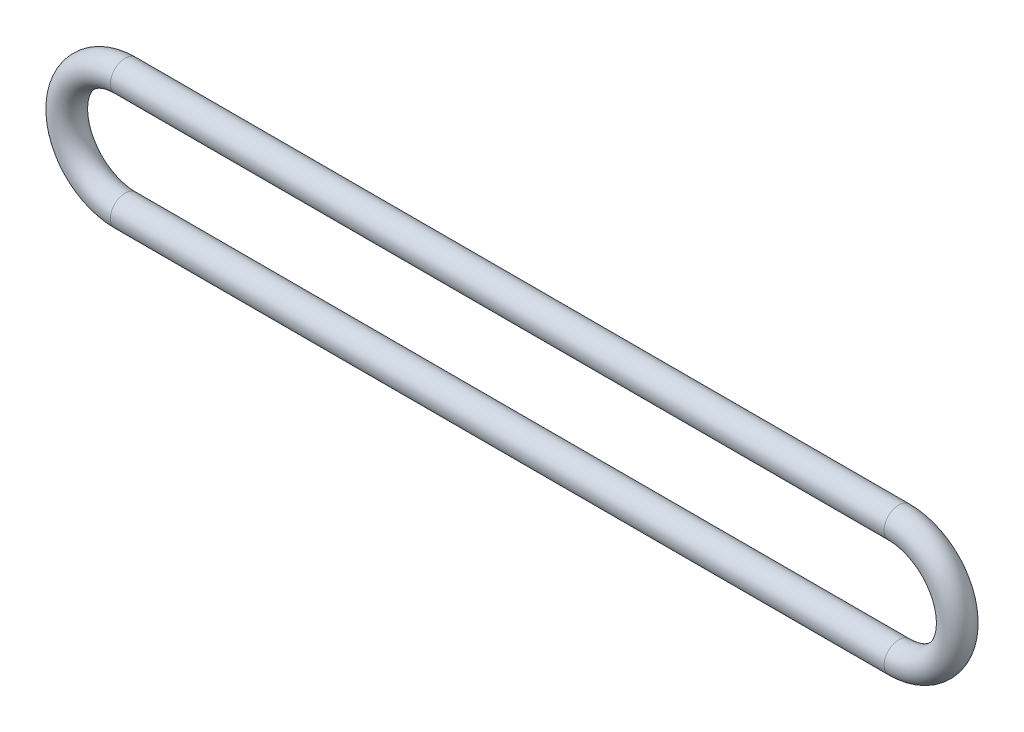
ISO-10303-21;
HEADER;
FILE_DESCRIPTION(('STEP AP214'),'2;1');
FILE_NAME('part.step','',(''),(''),'','','');
FILE_SCHEMA(('AUTOMOTIVE_DESIGN { 1 0 10303 214 1 1 1 1 }'));
ENDSEC;
DATA;
#1=APPLICATION_CONTEXT('core data for automotive mechanical design processes');
#2=APPLICATION_PROTOCOL_DEFINITION('international standard','automotive_design',2000,#1);
#3=PRODUCT_CONTEXT('',#1,'mechanical');
#4=PRODUCT('Part','Part','',(#3));
#5=PRODUCT_RELATED_PRODUCT_CATEGORY('part','',(#4));
#6=PRODUCT_DEFINITION_FORMATION('','',#4);
#7=PRODUCT_DEFINITION_CONTEXT('part definition',#1,'design');
#8=PRODUCT_DEFINITION('design','',#6,#7);
#9=PRODUCT_DEFINITION_SHAPE('','',#8);
#10=(LENGTH_UNIT() NAMED_UNIT(*) SI_UNIT(.MILLI.,.METRE.));
#11=(NAMED_UNIT(*) PLANE_ANGLE_UNIT() SI_UNIT($,.RADIAN.));
#12=(NAMED_UNIT(*) SI_UNIT($,.STERADIAN.) SOLID_ANGLE_UNIT());
#13=UNCERTAINTY_MEASURE_WITH_UNIT(LENGTH_MEASURE(1.E-05),#10,'distance_accuracy_value','');
#14=(GEOMETRIC_REPRESENTATION_CONTEXT(3) GLOBAL_UNCERTAINTY_ASSIGNED_CONTEXT((#13)) GLOBAL_UNIT_ASSIGNED_CONTEXT((#10,
#11,#12)) REPRESENTATION_CONTEXT('',''));
#15=CARTESIAN_POINT('',(0.,0.,0.));
#16=DIRECTION('',(0.,0.,1.));
#17=DIRECTION('',(1.,0.,0.));
#18=AXIS2_PLACEMENT_3D('',#15,#16,#17);
#19=CARTESIAN_POINT('',(-149.887077795981,36.381818823215,0.));
#20=DIRECTION('',(1.,0.,0.));
#21=DIRECTION('',(0.,1.,0.));
#22=AXIS2_PLACEMENT_3D('',#19,#20,#21);
#23=CYLINDRICAL_SURFACE('',#22,5.334);
#24=CARTESIAN_POINT('',(-149.887077795981,36.3818188232151,0.));
#25=DIRECTION('',(1.,0.,0.));
#26=DIRECTION('',(0.,1.,0.));
#27=AXIS2_PLACEMENT_3D('',#24,#25,#26);
#28=CIRCLE('',#27,5.334);
#29=CARTESIAN_POINT('',(-149.887077795981,41.7158188232151,0.));
#30=VERTEX_POINT('',#29);
#31=EDGE_CURVE('E49',#30,#30,#28,.F.);
#32=ORIENTED_EDGE('',*,*,#31,.F.);
#33=EDGE_LOOP('',(#32));
#34=FACE_BOUND('',#33,.T.);
#35=CARTESIAN_POINT('',(129.512922204019,36.3818188232151,0.));
#36=DIRECTION('',(1.,0.,0.));
#37=DIRECTION('',(0.,1.,0.));
#38=AXIS2_PLACEMENT_3D('',#35,#36,#37);
#39=CIRCLE('',#38,5.334);
#40=CARTESIAN_POINT('',(129.512922204019,41.7158188232151,0.));
#41=VERTEX_POINT('',#40);
#42=EDGE_CURVE('E27',#41,#41,#39,.T.);
#43=ORIENTED_EDGE('',*,*,#42,.F.);
#44=EDGE_LOOP('',(#43));
#45=FACE_BOUND('',#44,.T.);
#46=ADVANCED_FACE('F15',(#34,#45),#23,.T.);
#47=CARTESIAN_POINT('',(-149.887077795981,15.2998188232151,0.));
#48=DIRECTION('',(0.,0.,-1.));
#49=DIRECTION('',(1.,0.,0.));
#50=AXIS2_PLACEMENT_3D('',#47,#48,#49);
#51=TOROIDAL_SURFACE('',#50,21.082,5.334);
#52=CARTESIAN_POINT('',(-149.887077795981,-5.78218117678485,0.));
#53=DIRECTION('',(-1.,0.,0.));
#54=DIRECTION('',(0.,0.,1.));
#55=AXIS2_PLACEMENT_3D('',#52,#53,#54);
#56=CIRCLE('',#55,5.334);
#57=CARTESIAN_POINT('',(-149.887077795981,-5.78218117678485,5.334));
#58=VERTEX_POINT('',#57);
#59=EDGE_CURVE('E22',#58,#58,#56,.F.);
#60=ORIENTED_EDGE('',*,*,#59,.F.);
#61=EDGE_LOOP('',(#60));
#62=FACE_BOUND('',#61,.T.);
#63=ORIENTED_EDGE('',*,*,#31,.T.);
#64=EDGE_LOOP('',(#63));
#65=FACE_BOUND('',#64,.T.);
#66=ADVANCED_FACE('F42',(#62,#65),#51,.T.);
#67=CARTESIAN_POINT('',(129.512922204019,15.2998188232151,0.));
#68=DIRECTION('',(0.,0.,-1.));
#69=DIRECTION('',(-1.,0.,0.));
#70=AXIS2_PLACEMENT_3D('',#67,#68,#69);
#71=TOROIDAL_SURFACE('',#70,21.082,5.334);
#72=ORIENTED_EDGE('',*,*,#42,.T.);
#73=EDGE_LOOP('',(#72));
#74=FACE_BOUND('',#73,.T.);
#75=CARTESIAN_POINT('',(129.512922204019,-5.78218117678485,0.));
#76=DIRECTION('',(-1.,0.,0.));
#77=DIRECTION('',(0.,0.,1.));
#78=AXIS2_PLACEMENT_3D('',#75,#76,#77);
#79=CIRCLE('',#78,5.334);
#80=CARTESIAN_POINT('',(129.512922204019,-5.78218117678485,5.334));
#81=VERTEX_POINT('',#80);
#82=EDGE_CURVE('E10',#81,#81,#79,.T.);
#83=ORIENTED_EDGE('',*,*,#82,.F.);
#84=EDGE_LOOP('',(#83));
#85=FACE_BOUND('',#84,.T.);
#86=ADVANCED_FACE('F38',(#74,#85),#71,.T.);
#87=CARTESIAN_POINT('',(129.512922204019,-5.78218117678485,0.));
#88=DIRECTION('',(-1.,0.,0.));
#89=DIRECTION('',(0.,0.,1.));
#90=AXIS2_PLACEMENT_3D('',#87,#88,#89);
#91=CYLINDRICAL_SURFACE('',#90,5.334);
#92=ORIENTED_EDGE('',*,*,#82,.T.);
#93=EDGE_LOOP('',(#92));
#94=FACE_BOUND('',#93,.T.);
#95=ORIENTED_EDGE('',*,*,#59,.T.);
#96=EDGE_LOOP('',(#95));
#97=FACE_BOUND('',#96,.T.);
#98=ADVANCED_FACE('F41',(#94,#97),#91,.T.);
#99=CLOSED_SHELL('',(#46,#66,#86,#98));
#100=MANIFOLD_SOLID_BREP('B1',#99);
#101=ADVANCED_BREP_SHAPE_REPRESENTATION('',(#18,#100),#14);
#102=SHAPE_DEFINITION_REPRESENTATION(#9,#101);
ENDSEC;
END-ISO-10303-21;
